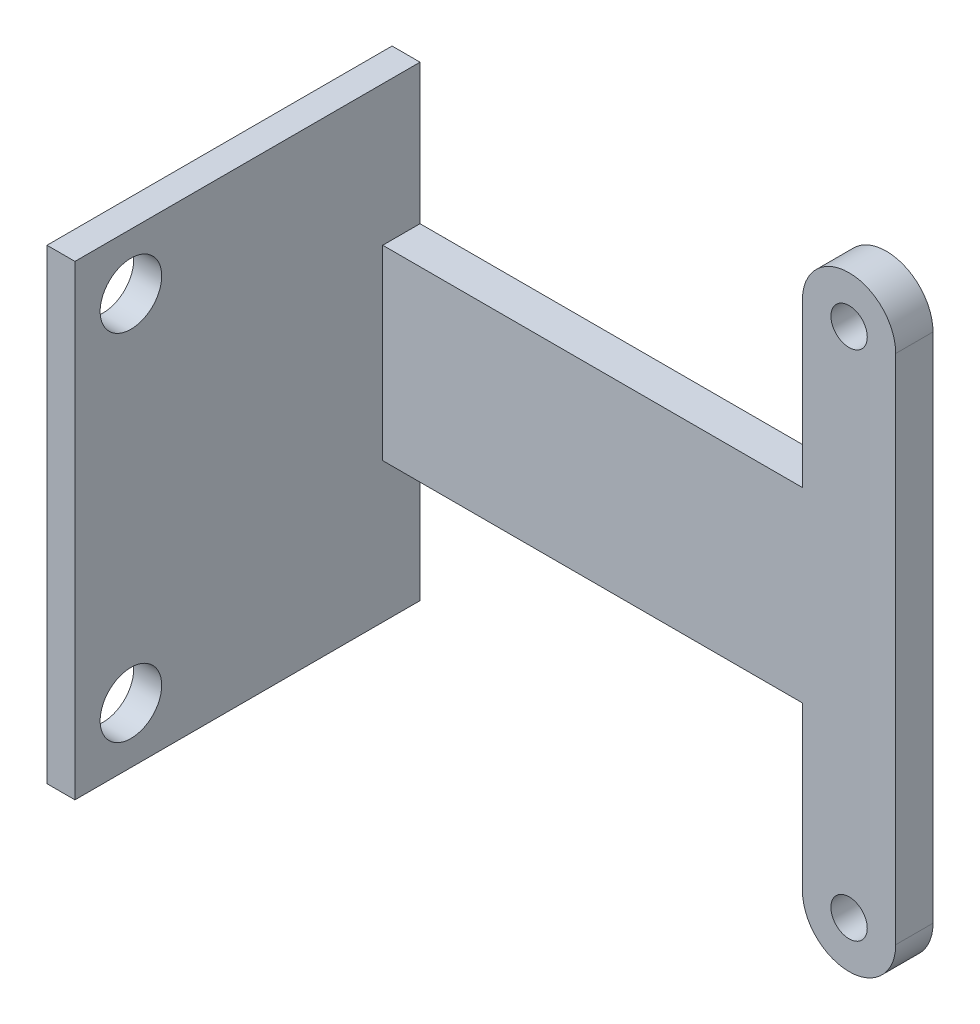
ISO-10303-21;
HEADER;
FILE_DESCRIPTION(('STEP AP214'),'2;1');
FILE_NAME('part.step','',(''),(''),'','','');
FILE_SCHEMA(('AUTOMOTIVE_DESIGN { 1 0 10303 214 1 1 1 1 }'));
ENDSEC;
DATA;
#1=APPLICATION_CONTEXT('core data for automotive mechanical design processes');
#2=APPLICATION_PROTOCOL_DEFINITION('international standard','automotive_design',2000,#1);
#3=PRODUCT_CONTEXT('',#1,'mechanical');
#4=PRODUCT('Part','Part','',(#3));
#5=PRODUCT_RELATED_PRODUCT_CATEGORY('part','',(#4));
#6=PRODUCT_DEFINITION_FORMATION('','',#4);
#7=PRODUCT_DEFINITION_CONTEXT('part definition',#1,'design');
#8=PRODUCT_DEFINITION('design','',#6,#7);
#9=PRODUCT_DEFINITION_SHAPE('','',#8);
#10=(LENGTH_UNIT() NAMED_UNIT(*) SI_UNIT(.MILLI.,.METRE.));
#11=(NAMED_UNIT(*) PLANE_ANGLE_UNIT() SI_UNIT($,.RADIAN.));
#12=(NAMED_UNIT(*) SI_UNIT($,.STERADIAN.) SOLID_ANGLE_UNIT());
#13=UNCERTAINTY_MEASURE_WITH_UNIT(LENGTH_MEASURE(1.E-05),#10,'distance_accuracy_value','');
#14=(GEOMETRIC_REPRESENTATION_CONTEXT(3) GLOBAL_UNCERTAINTY_ASSIGNED_CONTEXT((#13)) GLOBAL_UNIT_ASSIGNED_CONTEXT((#10,
#11,#12)) REPRESENTATION_CONTEXT('',''));
#15=CARTESIAN_POINT('',(0.,0.,0.));
#16=DIRECTION('',(0.,0.,1.));
#17=DIRECTION('',(1.,0.,0.));
#18=AXIS2_PLACEMENT_3D('',#15,#16,#17);
#19=CARTESIAN_POINT('',(-63.78,0.,-2.));
#20=DIRECTION('',(-1.,0.,0.));
#21=DIRECTION('',(0.,0.,1.));
#22=AXIS2_PLACEMENT_3D('',#19,#20,#21);
#23=PLANE('',#22);
#24=CARTESIAN_POINT('',(-63.78,19.,29.));
#25=DIRECTION('',(1.,0.,0.));
#26=DIRECTION('',(0.,0.,-1.));
#27=AXIS2_PLACEMENT_3D('',#24,#25,#26);
#28=CIRCLE('',#27,3.3);
#29=CARTESIAN_POINT('',(-63.78,19.,25.7));
#30=VERTEX_POINT('',#29);
#31=EDGE_CURVE('E360',#30,#30,#28,.T.);
#32=ORIENTED_EDGE('',*,*,#31,.F.);
#33=EDGE_LOOP('',(#32));
#34=FACE_BOUND('',#33,.T.);
#35=DIRECTION('',(0.,-1.,0.));
#36=VECTOR('',#35,1.);
#37=CARTESIAN_POINT('',(-63.78,0.,35.));
#38=LINE('',#37,#36);
#39=CARTESIAN_POINT('',(-63.78,25.,35.));
#40=VERTEX_POINT('',#39);
#41=CARTESIAN_POINT('',(-63.78,-25.,35.));
#42=VERTEX_POINT('',#41);
#43=EDGE_CURVE('E137',#40,#42,#38,.T.);
#44=ORIENTED_EDGE('',*,*,#43,.T.);
#45=DIRECTION('',(0.,0.,1.));
#46=VECTOR('',#45,1.);
#47=CARTESIAN_POINT('',(-63.78,-25.,-2.));
#48=LINE('',#47,#46);
#49=CARTESIAN_POINT('',(-63.78,-25.,-2.));
#50=VERTEX_POINT('',#49);
#51=EDGE_CURVE('E245',#50,#42,#48,.T.);
#52=ORIENTED_EDGE('',*,*,#51,.F.);
#53=DIRECTION('',(0.,-1.,0.));
#54=VECTOR('',#53,1.);
#55=CARTESIAN_POINT('',(-63.78,0.,-2.));
#56=LINE('',#55,#54);
#57=CARTESIAN_POINT('',(-63.78,-10.,-2.));
#58=VERTEX_POINT('',#57);
#59=EDGE_CURVE('E213',#58,#50,#56,.T.);
#60=ORIENTED_EDGE('',*,*,#59,.F.);
#61=DIRECTION('',(0.,0.,1.));
#62=VECTOR('',#61,1.);
#63=CARTESIAN_POINT('',(-63.78,-10.,-2.));
#64=LINE('',#63,#62);
#65=CARTESIAN_POINT('',(-63.78,-10.,2.));
#66=VERTEX_POINT('',#65);
#67=EDGE_CURVE('E242',#58,#66,#64,.T.);
#68=ORIENTED_EDGE('',*,*,#67,.T.);
#69=DIRECTION('',(0.,1.,0.));
#70=VECTOR('',#69,1.);
#71=CARTESIAN_POINT('',(-63.78,0.,2.));
#72=LINE('',#71,#70);
#73=CARTESIAN_POINT('',(-63.78,10.,2.));
#74=VERTEX_POINT('',#73);
#75=EDGE_CURVE('E11',#66,#74,#72,.T.);
#76=ORIENTED_EDGE('',*,*,#75,.T.);
#77=DIRECTION('',(0.,0.,1.));
#78=VECTOR('',#77,1.);
#79=CARTESIAN_POINT('',(-63.78,10.,-2.));
#80=LINE('',#79,#78);
#81=CARTESIAN_POINT('',(-63.78,10.,-2.));
#82=VERTEX_POINT('',#81);
#83=EDGE_CURVE('E145',#82,#74,#80,.T.);
#84=ORIENTED_EDGE('',*,*,#83,.F.);
#85=CARTESIAN_POINT('',(-63.78,25.,-2.));
#86=VERTEX_POINT('',#85);
#87=EDGE_CURVE('E139',#86,#82,#56,.T.);
#88=ORIENTED_EDGE('',*,*,#87,.F.);
#89=DIRECTION('',(0.,0.,1.));
#90=VECTOR('',#89,1.);
#91=CARTESIAN_POINT('',(-63.78,25.,-2.));
#92=LINE('',#91,#90);
#93=EDGE_CURVE('E133',#86,#40,#92,.T.);
#94=ORIENTED_EDGE('',*,*,#93,.T.);
#95=EDGE_LOOP('',(#44,#52,#60,#68,#76,#84,#88,#94));
#96=FACE_BOUND('',#95,.T.);
#97=CARTESIAN_POINT('',(-63.78,-19.,29.));
#98=DIRECTION('',(1.,0.,0.));
#99=DIRECTION('',(0.,0.,-1.));
#100=AXIS2_PLACEMENT_3D('',#97,#98,#99);
#101=CIRCLE('',#100,3.3);
#102=CARTESIAN_POINT('',(-63.78,-19.,25.7));
#103=VERTEX_POINT('',#102);
#104=EDGE_CURVE('E355',#103,#103,#101,.T.);
#105=ORIENTED_EDGE('',*,*,#104,.F.);
#106=EDGE_LOOP('',(#105));
#107=FACE_BOUND('',#106,.T.);
#108=ADVANCED_FACE('F41',(#34,#96,#107),#23,.F.);
#109=CARTESIAN_POINT('',(0.,0.,-2.));
#110=DIRECTION('',(0.,0.,1.));
#111=DIRECTION('',(1.,0.,0.));
#112=AXIS2_PLACEMENT_3D('',#109,#110,#111);
#113=PLANE('',#112);
#114=DIRECTION('',(0.,1.,0.));
#115=VECTOR('',#114,1.);
#116=CARTESIAN_POINT('',(-8.77999999999999,0.,-2.));
#117=LINE('',#116,#115);
#118=CARTESIAN_POINT('',(-8.77999999999999,-27.45,-2.));
#119=VERTEX_POINT('',#118);
#120=CARTESIAN_POINT('',(-8.77999999999999,27.45,-2.));
#121=VERTEX_POINT('',#120);
#122=EDGE_CURVE('E197',#119,#121,#117,.T.);
#123=ORIENTED_EDGE('',*,*,#122,.F.);
#124=CARTESIAN_POINT('',(-13.78,-27.45,-2.));
#125=DIRECTION('',(0.,0.,1.));
#126=DIRECTION('',(1.,0.,0.));
#127=AXIS2_PLACEMENT_3D('',#124,#125,#126);
#128=CIRCLE('',#127,5.00000000000001);
#129=CARTESIAN_POINT('',(-18.78,-27.45,-2.));
#130=VERTEX_POINT('',#129);
#131=EDGE_CURVE('E231',#130,#119,#128,.T.);
#132=ORIENTED_EDGE('',*,*,#131,.F.);
#133=DIRECTION('',(0.,1.,0.));
#134=VECTOR('',#133,1.);
#135=CARTESIAN_POINT('',(-18.78,0.,-2.));
#136=LINE('',#135,#134);
#137=CARTESIAN_POINT('',(-18.78,-10.,-2.));
#138=VERTEX_POINT('',#137);
#139=EDGE_CURVE('E228',#130,#138,#136,.T.);
#140=ORIENTED_EDGE('',*,*,#139,.T.);
#141=DIRECTION('',(1.,0.,0.));
#142=VECTOR('',#141,1.);
#143=CARTESIAN_POINT('',(0.,-10.,-2.));
#144=LINE('',#143,#142);
#145=EDGE_CURVE('E224',#58,#138,#144,.T.);
#146=ORIENTED_EDGE('',*,*,#145,.F.);
#147=ORIENTED_EDGE('',*,*,#59,.T.);
#148=DIRECTION('',(1.,0.,0.));
#149=VECTOR('',#148,1.);
#150=CARTESIAN_POINT('',(0.,-25.,-2.));
#151=LINE('',#150,#149);
#152=CARTESIAN_POINT('',(-66.78,-25.,-2.));
#153=VERTEX_POINT('',#152);
#154=EDGE_CURVE('E220',#153,#50,#151,.T.);
#155=ORIENTED_EDGE('',*,*,#154,.F.);
#156=DIRECTION('',(0.,-1.,0.));
#157=VECTOR('',#156,1.);
#158=CARTESIAN_POINT('',(-66.78,0.,-2.));
#159=LINE('',#158,#157);
#160=CARTESIAN_POINT('',(-66.78,25.,-2.));
#161=VERTEX_POINT('',#160);
#162=EDGE_CURVE('E216',#161,#153,#159,.T.);
#163=ORIENTED_EDGE('',*,*,#162,.F.);
#164=DIRECTION('',(1.,0.,0.));
#165=VECTOR('',#164,1.);
#166=CARTESIAN_POINT('',(0.,25.,-2.));
#167=LINE('',#166,#165);
#168=EDGE_CURVE('E212',#161,#86,#167,.T.);
#169=ORIENTED_EDGE('',*,*,#168,.T.);
#170=ORIENTED_EDGE('',*,*,#87,.T.);
#171=DIRECTION('',(1.,0.,0.));
#172=VECTOR('',#171,1.);
#173=CARTESIAN_POINT('',(0.,10.,-2.));
#174=LINE('',#173,#172);
#175=CARTESIAN_POINT('',(-18.78,10.,-2.));
#176=VERTEX_POINT('',#175);
#177=EDGE_CURVE('E207',#82,#176,#174,.T.);
#178=ORIENTED_EDGE('',*,*,#177,.T.);
#179=DIRECTION('',(0.,1.,0.));
#180=VECTOR('',#179,1.);
#181=CARTESIAN_POINT('',(-18.78,0.,-2.));
#182=LINE('',#181,#180);
#183=CARTESIAN_POINT('',(-18.78,27.45,-2.));
#184=VERTEX_POINT('',#183);
#185=EDGE_CURVE('E204',#176,#184,#182,.T.);
#186=ORIENTED_EDGE('',*,*,#185,.T.);
#187=CARTESIAN_POINT('',(-13.78,27.45,-2.));
#188=DIRECTION('',(0.,0.,1.));
#189=DIRECTION('',(1.,0.,0.));
#190=AXIS2_PLACEMENT_3D('',#187,#188,#189);
#191=CIRCLE('',#190,5.00000000000001);
#192=EDGE_CURVE('E200',#121,#184,#191,.T.);
#193=ORIENTED_EDGE('',*,*,#192,.F.);
#194=EDGE_LOOP('',(#123,#132,#140,#146,#147,#155,#163,#169,#170,#178,#186,#193));
#195=FACE_BOUND('',#194,.T.);
#196=CARTESIAN_POINT('',(-13.78,-27.45,-2.));
#197=DIRECTION('',(0.,0.,-1.));
#198=DIRECTION('',(-1.,0.,0.));
#199=AXIS2_PLACEMENT_3D('',#196,#197,#198);
#200=CIRCLE('',#199,1.94999999999999);
#201=CARTESIAN_POINT('',(-15.73,-27.45,-2.));
#202=VERTEX_POINT('',#201);
#203=EDGE_CURVE('E380',#202,#202,#200,.T.);
#204=ORIENTED_EDGE('',*,*,#203,.F.);
#205=EDGE_LOOP('',(#204));
#206=FACE_BOUND('',#205,.T.);
#207=CARTESIAN_POINT('',(-13.78,27.45,-2.));
#208=DIRECTION('',(0.,0.,-1.));
#209=DIRECTION('',(-1.,0.,0.));
#210=AXIS2_PLACEMENT_3D('',#207,#208,#209);
#211=CIRCLE('',#210,1.94999999999999);
#212=CARTESIAN_POINT('',(-15.73,27.45,-2.));
#213=VERTEX_POINT('',#212);
#214=EDGE_CURVE('E372',#213,#213,#211,.T.);
#215=ORIENTED_EDGE('',*,*,#214,.F.);
#216=EDGE_LOOP('',(#215));
#217=FACE_BOUND('',#216,.T.);
#218=ADVANCED_FACE('F274',(#195,#206,#217),#113,.F.);
#219=CARTESIAN_POINT('',(-8.77999999999999,0.,-2.));
#220=DIRECTION('',(1.,0.,0.));
#221=DIRECTION('',(0.,1.,0.));
#222=AXIS2_PLACEMENT_3D('',#219,#220,#221);
#223=PLANE('',#222);
#224=DIRECTION('',(0.,0.,1.));
#225=VECTOR('',#224,1.);
#226=CARTESIAN_POINT('',(-8.77999999999999,27.45,-2.));
#227=LINE('',#226,#225);
#228=CARTESIAN_POINT('',(-8.77999999999999,27.45,2.));
#229=VERTEX_POINT('',#228);
#230=EDGE_CURVE('E234',#121,#229,#227,.T.);
#231=ORIENTED_EDGE('',*,*,#230,.T.);
#232=DIRECTION('',(0.,1.,0.));
#233=VECTOR('',#232,1.);
#234=CARTESIAN_POINT('',(-8.77999999999999,0.,2.));
#235=LINE('',#234,#233);
#236=CARTESIAN_POINT('',(-8.77999999999999,-27.45,2.));
#237=VERTEX_POINT('',#236);
#238=EDGE_CURVE('E169',#237,#229,#235,.T.);
#239=ORIENTED_EDGE('',*,*,#238,.F.);
#240=DIRECTION('',(0.,0.,1.));
#241=VECTOR('',#240,1.);
#242=CARTESIAN_POINT('',(-8.77999999999999,-27.45,-2.));
#243=LINE('',#242,#241);
#244=EDGE_CURVE('E50',#119,#237,#243,.T.);
#245=ORIENTED_EDGE('',*,*,#244,.F.);
#246=ORIENTED_EDGE('',*,*,#122,.T.);
#247=EDGE_LOOP('',(#231,#239,#245,#246));
#248=FACE_BOUND('',#247,.T.);
#249=ADVANCED_FACE('F43',(#248),#223,.T.);
#250=CARTESIAN_POINT('',(-13.78,-27.45,-2.));
#251=DIRECTION('',(0.,0.,1.));
#252=DIRECTION('',(1.,0.,0.));
#253=AXIS2_PLACEMENT_3D('',#250,#251,#252);
#254=CYLINDRICAL_SURFACE('',#253,5.00000000000001);
#255=ORIENTED_EDGE('',*,*,#244,.T.);
#256=CARTESIAN_POINT('',(-13.78,-27.45,2.));
#257=DIRECTION('',(0.,0.,1.));
#258=DIRECTION('',(1.,0.,0.));
#259=AXIS2_PLACEMENT_3D('',#256,#257,#258);
#260=CIRCLE('',#259,5.00000000000001);
#261=CARTESIAN_POINT('',(-18.78,-27.45,2.));
#262=VERTEX_POINT('',#261);
#263=EDGE_CURVE('E193',#262,#237,#260,.T.);
#264=ORIENTED_EDGE('',*,*,#263,.F.);
#265=DIRECTION('',(0.,0.,1.));
#266=VECTOR('',#265,1.);
#267=CARTESIAN_POINT('',(-18.78,-27.45,-2.));
#268=LINE('',#267,#266);
#269=EDGE_CURVE('E64',#130,#262,#268,.T.);
#270=ORIENTED_EDGE('',*,*,#269,.F.);
#271=ORIENTED_EDGE('',*,*,#131,.T.);
#272=EDGE_LOOP('',(#255,#264,#270,#271));
#273=FACE_BOUND('',#272,.T.);
#274=ADVANCED_FACE('F271',(#273),#254,.T.);
#275=CARTESIAN_POINT('',(-18.78,0.,-2.));
#276=DIRECTION('',(1.,0.,0.));
#277=DIRECTION('',(0.,0.,-1.));
#278=AXIS2_PLACEMENT_3D('',#275,#276,#277);
#279=PLANE('',#278);
#280=ORIENTED_EDGE('',*,*,#269,.T.);
#281=DIRECTION('',(0.,1.,0.));
#282=VECTOR('',#281,1.);
#283=CARTESIAN_POINT('',(-18.78,0.,2.));
#284=LINE('',#283,#282);
#285=CARTESIAN_POINT('',(-18.78,-10.,2.));
#286=VERTEX_POINT('',#285);
#287=EDGE_CURVE('E189',#262,#286,#284,.T.);
#288=ORIENTED_EDGE('',*,*,#287,.T.);
#289=DIRECTION('',(0.,0.,1.));
#290=VECTOR('',#289,1.);
#291=CARTESIAN_POINT('',(-18.78,-10.,-2.));
#292=LINE('',#291,#290);
#293=EDGE_CURVE('E239',#138,#286,#292,.T.);
#294=ORIENTED_EDGE('',*,*,#293,.F.);
#295=ORIENTED_EDGE('',*,*,#139,.F.);
#296=EDGE_LOOP('',(#280,#288,#294,#295));
#297=FACE_BOUND('',#296,.T.);
#298=ADVANCED_FACE('F291',(#297),#279,.F.);
#299=CARTESIAN_POINT('',(0.,-10.,-2.));
#300=DIRECTION('',(0.,-1.,0.));
#301=DIRECTION('',(0.,0.,-1.));
#302=AXIS2_PLACEMENT_3D('',#299,#300,#301);
#303=PLANE('',#302);
#304=ORIENTED_EDGE('',*,*,#293,.T.);
#305=DIRECTION('',(1.,0.,0.));
#306=VECTOR('',#305,1.);
#307=CARTESIAN_POINT('',(0.,-10.,2.));
#308=LINE('',#307,#306);
#309=EDGE_CURVE('E185',#66,#286,#308,.T.);
#310=ORIENTED_EDGE('',*,*,#309,.F.);
#311=ORIENTED_EDGE('',*,*,#67,.F.);
#312=ORIENTED_EDGE('',*,*,#145,.T.);
#313=EDGE_LOOP('',(#304,#310,#311,#312));
#314=FACE_BOUND('',#313,.T.);
#315=ADVANCED_FACE('F289',(#314),#303,.T.);
#316=CARTESIAN_POINT('',(0.,-25.,-2.));
#317=DIRECTION('',(0.,-1.,0.));
#318=DIRECTION('',(0.,0.,-1.));
#319=AXIS2_PLACEMENT_3D('',#316,#317,#318);
#320=PLANE('',#319);
#321=DIRECTION('',(1.,0.,0.));
#322=VECTOR('',#321,1.);
#323=CARTESIAN_POINT('',(0.,-25.,35.));
#324=LINE('',#323,#322);
#325=CARTESIAN_POINT('',(-66.78,-25.,35.));
#326=VERTEX_POINT('',#325);
#327=EDGE_CURVE('E154',#326,#42,#324,.T.);
#328=ORIENTED_EDGE('',*,*,#327,.F.);
#329=DIRECTION('',(0.,0.,1.));
#330=VECTOR('',#329,1.);
#331=CARTESIAN_POINT('',(-66.78,-25.,-2.));
#332=LINE('',#331,#330);
#333=EDGE_CURVE('E248',#153,#326,#332,.T.);
#334=ORIENTED_EDGE('',*,*,#333,.F.);
#335=ORIENTED_EDGE('',*,*,#154,.T.);
#336=ORIENTED_EDGE('',*,*,#51,.T.);
#337=EDGE_LOOP('',(#328,#334,#335,#336));
#338=FACE_BOUND('',#337,.T.);
#339=ADVANCED_FACE('F298',(#338),#320,.T.);
#340=CARTESIAN_POINT('',(-66.78,0.,-2.));
#341=DIRECTION('',(-1.,0.,0.));
#342=DIRECTION('',(0.,0.,1.));
#343=AXIS2_PLACEMENT_3D('',#340,#341,#342);
#344=PLANE('',#343);
#345=CARTESIAN_POINT('',(-66.78,-19.,29.));
#346=DIRECTION('',(-1.,0.,0.));
#347=DIRECTION('',(0.,0.,1.));
#348=AXIS2_PLACEMENT_3D('',#345,#346,#347);
#349=CIRCLE('',#348,3.3);
#350=CARTESIAN_POINT('',(-66.78,-19.,32.3));
#351=VERTEX_POINT('',#350);
#352=EDGE_CURVE('E358',#351,#351,#349,.T.);
#353=ORIENTED_EDGE('',*,*,#352,.F.);
#354=EDGE_LOOP('',(#353));
#355=FACE_BOUND('',#354,.T.);
#356=CARTESIAN_POINT('',(-66.78,19.,29.));
#357=DIRECTION('',(-1.,0.,0.));
#358=DIRECTION('',(0.,0.,1.));
#359=AXIS2_PLACEMENT_3D('',#356,#357,#358);
#360=CIRCLE('',#359,3.3);
#361=CARTESIAN_POINT('',(-66.78,19.,32.3));
#362=VERTEX_POINT('',#361);
#363=EDGE_CURVE('E365',#362,#362,#360,.T.);
#364=ORIENTED_EDGE('',*,*,#363,.F.);
#365=EDGE_LOOP('',(#364));
#366=FACE_BOUND('',#365,.T.);
#367=DIRECTION('',(0.,-1.,0.));
#368=VECTOR('',#367,1.);
#369=CARTESIAN_POINT('',(-66.78,0.,35.));
#370=LINE('',#369,#368);
#371=CARTESIAN_POINT('',(-66.78,25.,35.));
#372=VERTEX_POINT('',#371);
#373=EDGE_CURVE('E161',#372,#326,#370,.T.);
#374=ORIENTED_EDGE('',*,*,#373,.F.);
#375=DIRECTION('',(0.,0.,1.));
#376=VECTOR('',#375,1.);
#377=CARTESIAN_POINT('',(-66.78,25.,-2.));
#378=LINE('',#377,#376);
#379=EDGE_CURVE('E144',#161,#372,#378,.T.);
#380=ORIENTED_EDGE('',*,*,#379,.F.);
#381=ORIENTED_EDGE('',*,*,#162,.T.);
#382=ORIENTED_EDGE('',*,*,#333,.T.);
#383=EDGE_LOOP('',(#374,#380,#381,#382));
#384=FACE_BOUND('',#383,.T.);
#385=ADVANCED_FACE('F312',(#355,#366,#384),#344,.T.);
#386=CARTESIAN_POINT('',(0.,25.,-2.));
#387=DIRECTION('',(0.,-1.,0.));
#388=DIRECTION('',(0.,0.,-1.));
#389=AXIS2_PLACEMENT_3D('',#386,#387,#388);
#390=PLANE('',#389);
#391=DIRECTION('',(1.,0.,0.));
#392=VECTOR('',#391,1.);
#393=CARTESIAN_POINT('',(0.,25.,35.));
#394=LINE('',#393,#392);
#395=EDGE_CURVE('E152',#372,#40,#394,.T.);
#396=ORIENTED_EDGE('',*,*,#395,.T.);
#397=ORIENTED_EDGE('',*,*,#93,.F.);
#398=ORIENTED_EDGE('',*,*,#168,.F.);
#399=ORIENTED_EDGE('',*,*,#379,.T.);
#400=EDGE_LOOP('',(#396,#397,#398,#399));
#401=FACE_BOUND('',#400,.T.);
#402=ADVANCED_FACE('F158',(#401),#390,.F.);
#403=CARTESIAN_POINT('',(0.,10.,-2.));
#404=DIRECTION('',(0.,-1.,0.));
#405=DIRECTION('',(0.,0.,-1.));
#406=AXIS2_PLACEMENT_3D('',#403,#404,#405);
#407=PLANE('',#406);
#408=ORIENTED_EDGE('',*,*,#83,.T.);
#409=DIRECTION('',(1.,0.,0.));
#410=VECTOR('',#409,1.);
#411=CARTESIAN_POINT('',(0.,10.,2.));
#412=LINE('',#411,#410);
#413=CARTESIAN_POINT('',(-18.78,10.,2.));
#414=VERTEX_POINT('',#413);
#415=EDGE_CURVE('E181',#74,#414,#412,.T.);
#416=ORIENTED_EDGE('',*,*,#415,.T.);
#417=DIRECTION('',(0.,0.,1.));
#418=VECTOR('',#417,1.);
#419=CARTESIAN_POINT('',(-18.78,10.,-2.));
#420=LINE('',#419,#418);
#421=EDGE_CURVE('E255',#176,#414,#420,.T.);
#422=ORIENTED_EDGE('',*,*,#421,.F.);
#423=ORIENTED_EDGE('',*,*,#177,.F.);
#424=EDGE_LOOP('',(#408,#416,#422,#423));
#425=FACE_BOUND('',#424,.T.);
#426=ADVANCED_FACE('F285',(#425),#407,.F.);
#427=CARTESIAN_POINT('',(-18.78,0.,-2.));
#428=DIRECTION('',(1.,0.,0.));
#429=DIRECTION('',(0.,1.,0.));
#430=AXIS2_PLACEMENT_3D('',#427,#428,#429);
#431=PLANE('',#430);
#432=ORIENTED_EDGE('',*,*,#421,.T.);
#433=DIRECTION('',(0.,1.,0.));
#434=VECTOR('',#433,1.);
#435=CARTESIAN_POINT('',(-18.78,0.,2.));
#436=LINE('',#435,#434);
#437=CARTESIAN_POINT('',(-18.78,27.45,2.));
#438=VERTEX_POINT('',#437);
#439=EDGE_CURVE('E177',#414,#438,#436,.T.);
#440=ORIENTED_EDGE('',*,*,#439,.T.);
#441=DIRECTION('',(0.,0.,1.));
#442=VECTOR('',#441,1.);
#443=CARTESIAN_POINT('',(-18.78,27.45,-2.));
#444=LINE('',#443,#442);
#445=EDGE_CURVE('E258',#184,#438,#444,.T.);
#446=ORIENTED_EDGE('',*,*,#445,.F.);
#447=ORIENTED_EDGE('',*,*,#185,.F.);
#448=EDGE_LOOP('',(#432,#440,#446,#447));
#449=FACE_BOUND('',#448,.T.);
#450=ADVANCED_FACE('F282',(#449),#431,.F.);
#451=CARTESIAN_POINT('',(-13.78,27.45,-2.));
#452=DIRECTION('',(0.,0.,1.));
#453=DIRECTION('',(1.,0.,0.));
#454=AXIS2_PLACEMENT_3D('',#451,#452,#453);
#455=CYLINDRICAL_SURFACE('',#454,5.00000000000001);
#456=ORIENTED_EDGE('',*,*,#445,.T.);
#457=CARTESIAN_POINT('',(-13.78,27.45,2.));
#458=DIRECTION('',(0.,0.,1.));
#459=DIRECTION('',(1.,0.,0.));
#460=AXIS2_PLACEMENT_3D('',#457,#458,#459);
#461=CIRCLE('',#460,5.00000000000001);
#462=EDGE_CURVE('E173',#229,#438,#461,.T.);
#463=ORIENTED_EDGE('',*,*,#462,.F.);
#464=ORIENTED_EDGE('',*,*,#230,.F.);
#465=ORIENTED_EDGE('',*,*,#192,.T.);
#466=EDGE_LOOP('',(#456,#463,#464,#465));
#467=FACE_BOUND('',#466,.T.);
#468=ADVANCED_FACE('F264',(#467),#455,.T.);
#469=CARTESIAN_POINT('',(0.,0.,2.));
#470=DIRECTION('',(0.,0.,1.));
#471=DIRECTION('',(1.,0.,0.));
#472=AXIS2_PLACEMENT_3D('',#469,#470,#471);
#473=PLANE('',#472);
#474=CARTESIAN_POINT('',(-13.78,27.45,2.));
#475=DIRECTION('',(0.,0.,1.));
#476=DIRECTION('',(1.,0.,0.));
#477=AXIS2_PLACEMENT_3D('',#474,#475,#476);
#478=CIRCLE('',#477,1.94999999999999);
#479=CARTESIAN_POINT('',(-11.83,27.45,2.));
#480=VERTEX_POINT('',#479);
#481=EDGE_CURVE('E376',#480,#480,#478,.T.);
#482=ORIENTED_EDGE('',*,*,#481,.F.);
#483=EDGE_LOOP('',(#482));
#484=FACE_BOUND('',#483,.T.);
#485=CARTESIAN_POINT('',(-13.78,-27.45,2.));
#486=DIRECTION('',(0.,0.,1.));
#487=DIRECTION('',(1.,0.,0.));
#488=AXIS2_PLACEMENT_3D('',#485,#486,#487);
#489=CIRCLE('',#488,1.94999999999999);
#490=CARTESIAN_POINT('',(-11.83,-27.45,2.));
#491=VERTEX_POINT('',#490);
#492=EDGE_CURVE('E156',#491,#491,#489,.T.);
#493=ORIENTED_EDGE('',*,*,#492,.F.);
#494=EDGE_LOOP('',(#493));
#495=FACE_BOUND('',#494,.T.);
#496=ORIENTED_EDGE('',*,*,#75,.F.);
#497=ORIENTED_EDGE('',*,*,#309,.T.);
#498=ORIENTED_EDGE('',*,*,#287,.F.);
#499=ORIENTED_EDGE('',*,*,#263,.T.);
#500=ORIENTED_EDGE('',*,*,#238,.T.);
#501=ORIENTED_EDGE('',*,*,#462,.T.);
#502=ORIENTED_EDGE('',*,*,#439,.F.);
#503=ORIENTED_EDGE('',*,*,#415,.F.);
#504=EDGE_LOOP('',(#496,#497,#498,#499,#500,#501,#502,#503));
#505=FACE_BOUND('',#504,.T.);
#506=ADVANCED_FACE('F269',(#484,#495,#505),#473,.T.);
#507=CARTESIAN_POINT('',(0.,0.,35.));
#508=DIRECTION('',(0.,0.,1.));
#509=DIRECTION('',(1.,0.,0.));
#510=AXIS2_PLACEMENT_3D('',#507,#508,#509);
#511=PLANE('',#510);
#512=ORIENTED_EDGE('',*,*,#43,.F.);
#513=ORIENTED_EDGE('',*,*,#395,.F.);
#514=ORIENTED_EDGE('',*,*,#373,.T.);
#515=ORIENTED_EDGE('',*,*,#327,.T.);
#516=EDGE_LOOP('',(#512,#513,#514,#515));
#517=FACE_BOUND('',#516,.T.);
#518=ADVANCED_FACE('F150',(#517),#511,.T.);
#519=CARTESIAN_POINT('',(-13.78,-27.45,-2.));
#520=DIRECTION('',(0.,0.,-1.));
#521=DIRECTION('',(-1.,0.,0.));
#522=AXIS2_PLACEMENT_3D('',#519,#520,#521);
#523=CYLINDRICAL_SURFACE('',#522,1.94999999999999);
#524=ORIENTED_EDGE('',*,*,#203,.T.);
#525=EDGE_LOOP('',(#524));
#526=FACE_BOUND('',#525,.T.);
#527=ORIENTED_EDGE('',*,*,#492,.T.);
#528=EDGE_LOOP('',(#527));
#529=FACE_BOUND('',#528,.T.);
#530=ADVANCED_FACE('F331',(#526,#529),#523,.F.);
#531=CARTESIAN_POINT('',(-13.78,27.45,-2.));
#532=DIRECTION('',(0.,0.,-1.));
#533=DIRECTION('',(-1.,0.,0.));
#534=AXIS2_PLACEMENT_3D('',#531,#532,#533);
#535=CYLINDRICAL_SURFACE('',#534,1.94999999999999);
#536=ORIENTED_EDGE('',*,*,#214,.T.);
#537=EDGE_LOOP('',(#536));
#538=FACE_BOUND('',#537,.T.);
#539=ORIENTED_EDGE('',*,*,#481,.T.);
#540=EDGE_LOOP('',(#539));
#541=FACE_BOUND('',#540,.T.);
#542=ADVANCED_FACE('F338',(#538,#541),#535,.F.);
#543=CARTESIAN_POINT('',(-63.78,19.,29.));
#544=DIRECTION('',(1.,0.,0.));
#545=DIRECTION('',(0.,0.,-1.));
#546=AXIS2_PLACEMENT_3D('',#543,#544,#545);
#547=CYLINDRICAL_SURFACE('',#546,3.3);
#548=ORIENTED_EDGE('',*,*,#31,.T.);
#549=EDGE_LOOP('',(#548));
#550=FACE_BOUND('',#549,.T.);
#551=ORIENTED_EDGE('',*,*,#363,.T.);
#552=EDGE_LOOP('',(#551));
#553=FACE_BOUND('',#552,.T.);
#554=ADVANCED_FACE('F342',(#550,#553),#547,.F.);
#555=CARTESIAN_POINT('',(-63.78,-19.,29.));
#556=DIRECTION('',(1.,0.,0.));
#557=DIRECTION('',(0.,0.,-1.));
#558=AXIS2_PLACEMENT_3D('',#555,#556,#557);
#559=CYLINDRICAL_SURFACE('',#558,3.3);
#560=ORIENTED_EDGE('',*,*,#104,.T.);
#561=EDGE_LOOP('',(#560));
#562=FACE_BOUND('',#561,.T.);
#563=ORIENTED_EDGE('',*,*,#352,.T.);
#564=EDGE_LOOP('',(#563));
#565=FACE_BOUND('',#564,.T.);
#566=ADVANCED_FACE('F346',(#562,#565),#559,.F.);
#567=CLOSED_SHELL('',(#108,#218,#249,#274,#298,#315,#339,#385,#402,#426,#450,#468,#506,#518,
#530,#542,#554,#566));
#568=MANIFOLD_SOLID_BREP('B2',#567);
#569=ADVANCED_BREP_SHAPE_REPRESENTATION('',(#18,#568),#14);
#570=SHAPE_DEFINITION_REPRESENTATION(#9,#569);
ENDSEC;
END-ISO-10303-21;
